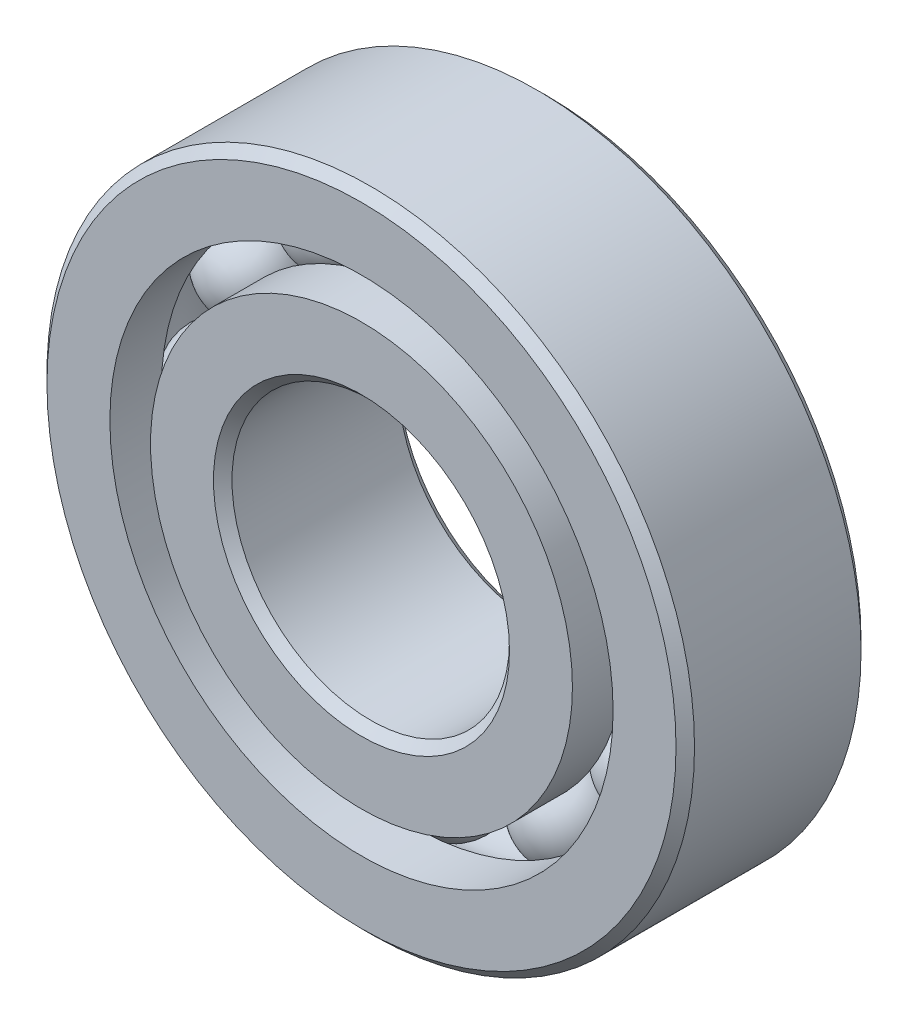
ISO-10303-21;
HEADER;
FILE_DESCRIPTION(('STEP AP214'),'2;1');
FILE_NAME('part.step','',(''),(''),'','','');
FILE_SCHEMA(('AUTOMOTIVE_DESIGN { 1 0 10303 214 1 1 1 1 }'));
ENDSEC;
DATA;
#1=APPLICATION_CONTEXT('core data for automotive mechanical design processes');
#2=APPLICATION_PROTOCOL_DEFINITION('international standard','automotive_design',2000,#1);
#3=PRODUCT_CONTEXT('',#1,'mechanical');
#4=PRODUCT('Part','Part','',(#3));
#5=PRODUCT_RELATED_PRODUCT_CATEGORY('part','',(#4));
#6=PRODUCT_DEFINITION_FORMATION('','',#4);
#7=PRODUCT_DEFINITION_CONTEXT('part definition',#1,'design');
#8=PRODUCT_DEFINITION('design','',#6,#7);
#9=PRODUCT_DEFINITION_SHAPE('','',#8);
#10=(LENGTH_UNIT() NAMED_UNIT(*) SI_UNIT(.MILLI.,.METRE.));
#11=(NAMED_UNIT(*) PLANE_ANGLE_UNIT() SI_UNIT($,.RADIAN.));
#12=(NAMED_UNIT(*) SI_UNIT($,.STERADIAN.) SOLID_ANGLE_UNIT());
#13=UNCERTAINTY_MEASURE_WITH_UNIT(LENGTH_MEASURE(1.E-05),#10,'distance_accuracy_value','');
#14=(GEOMETRIC_REPRESENTATION_CONTEXT(3) GLOBAL_UNCERTAINTY_ASSIGNED_CONTEXT((#13)) GLOBAL_UNIT_ASSIGNED_CONTEXT((#10,
#11,#12)) REPRESENTATION_CONTEXT('',''));
#15=CARTESIAN_POINT('',(0.,0.,0.));
#16=DIRECTION('',(0.,0.,1.));
#17=DIRECTION('',(1.,0.,0.));
#18=AXIS2_PLACEMENT_3D('',#15,#16,#17);
#19=CARTESIAN_POINT('',(-4.99999999999989,8.66025403784445,0.));
#20=DIRECTION('',(0.,0.,1.));
#21=DIRECTION('',(-0.499999999999989,0.866025403784445,0.));
#22=AXIS2_PLACEMENT_3D('',#19,#20,#21);
#23=SPHERICAL_SURFACE('',#22,1.9832668371318);
#24=CARTESIAN_POINT('',(-4.99999999999989,8.66025403784445,1.98326683713179));
#25=VERTEX_POINT('',#24);
#26=VERTEX_LOOP('',#25);
#27=FACE_BOUND('',#26,.T.);
#28=ADVANCED_FACE('F37',(#27),#23,.T.);
#29=CLOSED_SHELL('',(#28));
#30=MANIFOLD_SOLID_BREP('B2',#29);
#31=CARTESIAN_POINT('',(-8.66025403784433,5.0000000000001,0.));
#32=DIRECTION('',(0.,0.,1.));
#33=DIRECTION('',(-0.866025403784433,0.50000000000001,0.));
#34=AXIS2_PLACEMENT_3D('',#31,#32,#33);
#35=SPHERICAL_SURFACE('',#34,1.9832668371318);
#36=CARTESIAN_POINT('',(-8.66025403784433,5.0000000000001,1.98326683713179));
#37=VERTEX_POINT('',#36);
#38=VERTEX_LOOP('',#37);
#39=FACE_BOUND('',#38,.T.);
#40=ADVANCED_FACE('F57',(#39),#35,.T.);
#41=CLOSED_SHELL('',(#40));
#42=MANIFOLD_SOLID_BREP('B6',#41);
#43=CARTESIAN_POINT('',(-10.,1.04744440165294E-13,0.));
#44=DIRECTION('',(0.,0.,1.));
#45=DIRECTION('',(-1.,0.,0.));
#46=AXIS2_PLACEMENT_3D('',#43,#44,#45);
#47=SPHERICAL_SURFACE('',#46,1.9832668371318);
#48=CARTESIAN_POINT('',(-10.,1.04744440165294E-13,1.98326683713179));
#49=VERTEX_POINT('',#48);
#50=VERTEX_LOOP('',#49);
#51=FACE_BOUND('',#50,.T.);
#52=ADVANCED_FACE('F77',(#51),#47,.T.);
#53=CLOSED_SHELL('',(#52));
#54=MANIFOLD_SOLID_BREP('B33',#53);
#55=CARTESIAN_POINT('',(-8.66025403784443,-4.99999999999992,0.));
#56=DIRECTION('',(0.,0.,1.));
#57=DIRECTION('',(-0.866025403784443,-0.499999999999992,0.));
#58=AXIS2_PLACEMENT_3D('',#55,#56,#57);
#59=SPHERICAL_SURFACE('',#58,1.9832668371318);
#60=CARTESIAN_POINT('',(-8.66025403784443,-4.99999999999992,1.98326683713179));
#61=VERTEX_POINT('',#60);
#62=VERTEX_LOOP('',#61);
#63=FACE_BOUND('',#62,.T.);
#64=ADVANCED_FACE('F97',(#63),#59,.T.);
#65=CLOSED_SHELL('',(#64));
#66=MANIFOLD_SOLID_BREP('B53',#65);
#67=CARTESIAN_POINT('',(-5.00000000000007,-8.66025403784434,0.));
#68=DIRECTION('',(0.,0.,1.));
#69=DIRECTION('',(-0.500000000000007,-0.866025403784435,0.));
#70=AXIS2_PLACEMENT_3D('',#67,#68,#69);
#71=SPHERICAL_SURFACE('',#70,1.9832668371318);
#72=CARTESIAN_POINT('',(-5.00000000000007,-8.66025403784434,1.98326683713179));
#73=VERTEX_POINT('',#72);
#74=VERTEX_LOOP('',#73);
#75=FACE_BOUND('',#74,.T.);
#76=ADVANCED_FACE('F117',(#75),#71,.T.);
#77=CLOSED_SHELL('',(#76));
#78=MANIFOLD_SOLID_BREP('B73',#77);
#79=CARTESIAN_POINT('',(0.,-10.,0.));
#80=DIRECTION('',(0.,0.,1.));
#81=DIRECTION('',(0.,-1.,0.));
#82=AXIS2_PLACEMENT_3D('',#79,#80,#81);
#83=SPHERICAL_SURFACE('',#82,1.9832668371318);
#84=CARTESIAN_POINT('',(0.,-10.,1.98326683713179));
#85=VERTEX_POINT('',#84);
#86=VERTEX_LOOP('',#85);
#87=FACE_BOUND('',#86,.T.);
#88=ADVANCED_FACE('F137',(#87),#83,.T.);
#89=CLOSED_SHELL('',(#88));
#90=MANIFOLD_SOLID_BREP('B93',#89);
#91=CARTESIAN_POINT('',(4.99999999999995,-8.66025403784441,0.));
#92=DIRECTION('',(0.,0.,1.));
#93=DIRECTION('',(0.499999999999995,-0.866025403784442,0.));
#94=AXIS2_PLACEMENT_3D('',#91,#92,#93);
#95=SPHERICAL_SURFACE('',#94,1.9832668371318);
#96=CARTESIAN_POINT('',(4.99999999999995,-8.66025403784441,1.98326683713179));
#97=VERTEX_POINT('',#96);
#98=VERTEX_LOOP('',#97);
#99=FACE_BOUND('',#98,.T.);
#100=ADVANCED_FACE('F157',(#99),#95,.T.);
#101=CLOSED_SHELL('',(#100));
#102=MANIFOLD_SOLID_BREP('B113',#101);
#103=CARTESIAN_POINT('',(8.66025403784436,-5.00000000000004,0.));
#104=DIRECTION('',(0.,0.,1.));
#105=DIRECTION('',(0.866025403784436,-0.500000000000004,0.));
#106=AXIS2_PLACEMENT_3D('',#103,#104,#105);
#107=SPHERICAL_SURFACE('',#106,1.9832668371318);
#108=CARTESIAN_POINT('',(8.66025403784436,-5.00000000000004,1.98326683713179));
#109=VERTEX_POINT('',#108);
#110=VERTEX_LOOP('',#109);
#111=FACE_BOUND('',#110,.T.);
#112=ADVANCED_FACE('F177',(#111),#107,.T.);
#113=CLOSED_SHELL('',(#112));
#114=MANIFOLD_SOLID_BREP('B133',#113);
#115=CARTESIAN_POINT('',(10.,0.,0.));
#116=DIRECTION('',(0.,0.,1.));
#117=DIRECTION('',(1.,0.,0.));
#118=AXIS2_PLACEMENT_3D('',#115,#116,#117);
#119=SPHERICAL_SURFACE('',#118,1.9832668371318);
#120=CARTESIAN_POINT('',(10.,0.,1.98326683713179));
#121=VERTEX_POINT('',#120);
#122=VERTEX_LOOP('',#121);
#123=FACE_BOUND('',#122,.T.);
#124=ADVANCED_FACE('F197',(#123),#119,.T.);
#125=CLOSED_SHELL('',(#124));
#126=MANIFOLD_SOLID_BREP('B153',#125);
#127=CARTESIAN_POINT('',(8.6602540378444,4.99999999999998,0.));
#128=DIRECTION('',(0.,0.,1.));
#129=DIRECTION('',(0.86602540378444,0.499999999999998,0.));
#130=AXIS2_PLACEMENT_3D('',#127,#128,#129);
#131=SPHERICAL_SURFACE('',#130,1.9832668371318);
#132=CARTESIAN_POINT('',(8.6602540378444,4.99999999999998,1.98326683713179));
#133=VERTEX_POINT('',#132);
#134=VERTEX_LOOP('',#133);
#135=FACE_BOUND('',#134,.T.);
#136=ADVANCED_FACE('F217',(#135),#131,.T.);
#137=CLOSED_SHELL('',(#136));
#138=MANIFOLD_SOLID_BREP('B173',#137);
#139=CARTESIAN_POINT('',(5.00000000000001,8.66025403784438,0.));
#140=DIRECTION('',(0.,0.,1.));
#141=DIRECTION('',(0.500000000000001,0.866025403784438,0.));
#142=AXIS2_PLACEMENT_3D('',#139,#140,#141);
#143=SPHERICAL_SURFACE('',#142,1.9832668371318);
#144=CARTESIAN_POINT('',(5.00000000000001,8.66025403784438,1.98326683713179));
#145=VERTEX_POINT('',#144);
#146=VERTEX_LOOP('',#145);
#147=FACE_BOUND('',#146,.T.);
#148=ADVANCED_FACE('F237',(#147),#143,.T.);
#149=CLOSED_SHELL('',(#148));
#150=MANIFOLD_SOLID_BREP('B193',#149);
#151=CARTESIAN_POINT('',(0.,10.,0.));
#152=DIRECTION('',(0.,0.,1.));
#153=DIRECTION('',(0.,1.,0.));
#154=AXIS2_PLACEMENT_3D('',#151,#152,#153);
#155=SPHERICAL_SURFACE('',#154,1.9832668371318);
#156=CARTESIAN_POINT('',(0.,10.,1.98326683713179));
#157=VERTEX_POINT('',#156);
#158=VERTEX_LOOP('',#157);
#159=FACE_BOUND('',#158,.T.);
#160=ADVANCED_FACE('F259',(#159),#155,.T.);
#161=CLOSED_SHELL('',(#160));
#162=MANIFOLD_SOLID_BREP('B213',#161);
#163=CARTESIAN_POINT('',(0.,9.12087912087913,4.00000000000001));
#164=DIRECTION('',(0.,0.,-1.));
#165=DIRECTION('',(-1.,0.,0.));
#166=AXIS2_PLACEMENT_3D('',#163,#164,#165);
#167=PLANE('',#166);
#168=CARTESIAN_POINT('',(0.,0.,4.));
#169=DIRECTION('',(0.,0.,1.));
#170=DIRECTION('',(1.,0.,0.));
#171=AXIS2_PLACEMENT_3D('',#168,#169,#170);
#172=CIRCLE('',#171,6.4);
#173=CARTESIAN_POINT('',(6.4,0.,4.));
#174=VERTEX_POINT('',#173);
#175=EDGE_CURVE('E306',#174,#174,#172,.T.);
#176=ORIENTED_EDGE('',*,*,#175,.F.);
#177=EDGE_LOOP('',(#176));
#178=FACE_BOUND('',#177,.T.);
#179=CARTESIAN_POINT('',(0.,0.,4.00000000000001));
#180=DIRECTION('',(0.,0.,1.));
#181=DIRECTION('',(1.,0.,0.));
#182=AXIS2_PLACEMENT_3D('',#179,#180,#181);
#183=CIRCLE('',#182,9.12087912087913);
#184=CARTESIAN_POINT('',(9.12087912087913,0.,4.00000000000001));
#185=VERTEX_POINT('',#184);
#186=EDGE_CURVE('E258',#185,#185,#183,.T.);
#187=ORIENTED_EDGE('',*,*,#186,.T.);
#188=EDGE_LOOP('',(#187));
#189=FACE_BOUND('',#188,.T.);
#190=ADVANCED_FACE('F278',(#178,#189),#167,.F.);
#191=CARTESIAN_POINT('',(0.,0.,4.));
#192=DIRECTION('',(0.,0.,1.));
#193=DIRECTION('',(1.,0.,0.));
#194=AXIS2_PLACEMENT_3D('',#191,#192,#193);
#195=CYLINDRICAL_SURFACE('',#194,9.12087912087913);
#196=ORIENTED_EDGE('',*,*,#186,.F.);
#197=EDGE_LOOP('',(#196));
#198=FACE_BOUND('',#197,.T.);
#199=CARTESIAN_POINT('',(0.,0.,1.77777777777777));
#200=DIRECTION('',(0.,0.,1.));
#201=DIRECTION('',(1.,0.,0.));
#202=AXIS2_PLACEMENT_3D('',#199,#200,#201);
#203=CIRCLE('',#202,9.12087912087913);
#204=CARTESIAN_POINT('',(9.12087912087913,0.,1.77777777777777));
#205=VERTEX_POINT('',#204);
#206=EDGE_CURVE('E284',#205,#205,#203,.T.);
#207=ORIENTED_EDGE('',*,*,#206,.T.);
#208=EDGE_LOOP('',(#207));
#209=FACE_BOUND('',#208,.T.);
#210=ADVANCED_FACE('F313',(#198,#209),#195,.T.);
#211=CARTESIAN_POINT('',(0.,0.,0.));
#212=DIRECTION('',(0.,0.,1.));
#213=DIRECTION('',(1.,0.,0.));
#214=AXIS2_PLACEMENT_3D('',#211,#212,#213);
#215=TOROIDAL_SURFACE('',#214,10.,1.98326683713179);
#216=ORIENTED_EDGE('',*,*,#206,.F.);
#217=EDGE_LOOP('',(#216));
#218=FACE_BOUND('',#217,.T.);
#219=CARTESIAN_POINT('',(0.,0.,-1.77777777777778));
#220=DIRECTION('',(0.,0.,1.));
#221=DIRECTION('',(1.,0.,0.));
#222=AXIS2_PLACEMENT_3D('',#219,#220,#221);
#223=CIRCLE('',#222,9.12087912087913);
#224=CARTESIAN_POINT('',(9.12087912087913,0.,-1.77777777777778));
#225=VERTEX_POINT('',#224);
#226=EDGE_CURVE('E288',#225,#225,#223,.T.);
#227=ORIENTED_EDGE('',*,*,#226,.T.);
#228=EDGE_LOOP('',(#227));
#229=FACE_BOUND('',#228,.T.);
#230=ADVANCED_FACE('F317',(#218,#229),#215,.F.);
#231=CARTESIAN_POINT('',(0.,0.,4.));
#232=DIRECTION('',(0.,0.,1.));
#233=DIRECTION('',(1.,0.,0.));
#234=AXIS2_PLACEMENT_3D('',#231,#232,#233);
#235=CYLINDRICAL_SURFACE('',#234,9.12087912087913);
#236=ORIENTED_EDGE('',*,*,#226,.F.);
#237=EDGE_LOOP('',(#236));
#238=FACE_BOUND('',#237,.T.);
#239=CARTESIAN_POINT('',(0.,0.,-4.00000000000001));
#240=DIRECTION('',(0.,0.,1.));
#241=DIRECTION('',(1.,0.,0.));
#242=AXIS2_PLACEMENT_3D('',#239,#240,#241);
#243=CIRCLE('',#242,9.12087912087913);
#244=CARTESIAN_POINT('',(9.12087912087913,0.,-4.00000000000001));
#245=VERTEX_POINT('',#244);
#246=EDGE_CURVE('E292',#245,#245,#243,.T.);
#247=ORIENTED_EDGE('',*,*,#246,.T.);
#248=EDGE_LOOP('',(#247));
#249=FACE_BOUND('',#248,.T.);
#250=ADVANCED_FACE('F322',(#238,#249),#235,.T.);
#251=CARTESIAN_POINT('',(0.,6.4,-4.00000000000001));
#252=DIRECTION('',(0.,0.,1.));
#253=DIRECTION('',(1.,0.,0.));
#254=AXIS2_PLACEMENT_3D('',#251,#252,#253);
#255=PLANE('',#254);
#256=ORIENTED_EDGE('',*,*,#246,.F.);
#257=EDGE_LOOP('',(#256));
#258=FACE_BOUND('',#257,.T.);
#259=CARTESIAN_POINT('',(0.,0.,-4.00000000000001));
#260=DIRECTION('',(0.,0.,1.));
#261=DIRECTION('',(1.,0.,0.));
#262=AXIS2_PLACEMENT_3D('',#259,#260,#261);
#263=CIRCLE('',#262,6.4);
#264=CARTESIAN_POINT('',(6.4,0.,-4.00000000000001));
#265=VERTEX_POINT('',#264);
#266=EDGE_CURVE('E297',#265,#265,#263,.T.);
#267=ORIENTED_EDGE('',*,*,#266,.T.);
#268=EDGE_LOOP('',(#267));
#269=FACE_BOUND('',#268,.T.);
#270=ADVANCED_FACE('F328',(#258,#269),#255,.F.);
#271=CARTESIAN_POINT('',(0.,0.,-3.60000000000001));
#272=DIRECTION('',(0.,0.,-1.));
#273=DIRECTION('',(-1.,0.,0.));
#274=AXIS2_PLACEMENT_3D('',#271,#272,#273);
#275=CONICAL_SURFACE('',#274,6.,0.785398163397445);
#276=ORIENTED_EDGE('',*,*,#266,.F.);
#277=EDGE_LOOP('',(#276));
#278=FACE_BOUND('',#277,.T.);
#279=CARTESIAN_POINT('',(0.,0.,-3.60000000000001));
#280=DIRECTION('',(0.,0.,1.));
#281=DIRECTION('',(1.,0.,0.));
#282=AXIS2_PLACEMENT_3D('',#279,#280,#281);
#283=CIRCLE('',#282,6.);
#284=CARTESIAN_POINT('',(6.,0.,-3.60000000000001));
#285=VERTEX_POINT('',#284);
#286=EDGE_CURVE('E300',#285,#285,#283,.T.);
#287=ORIENTED_EDGE('',*,*,#286,.T.);
#288=EDGE_LOOP('',(#287));
#289=FACE_BOUND('',#288,.T.);
#290=ADVANCED_FACE('F332',(#278,#289),#275,.F.);
#291=CARTESIAN_POINT('',(0.,0.,4.));
#292=DIRECTION('',(0.,0.,1.));
#293=DIRECTION('',(1.,0.,0.));
#294=AXIS2_PLACEMENT_3D('',#291,#292,#293);
#295=CYLINDRICAL_SURFACE('',#294,6.);
#296=ORIENTED_EDGE('',*,*,#286,.F.);
#297=EDGE_LOOP('',(#296));
#298=FACE_BOUND('',#297,.T.);
#299=CARTESIAN_POINT('',(0.,0.,3.60000000000001));
#300=DIRECTION('',(0.,0.,1.));
#301=DIRECTION('',(1.,0.,0.));
#302=AXIS2_PLACEMENT_3D('',#299,#300,#301);
#303=CIRCLE('',#302,6.);
#304=CARTESIAN_POINT('',(6.,0.,3.60000000000001));
#305=VERTEX_POINT('',#304);
#306=EDGE_CURVE('E303',#305,#305,#303,.T.);
#307=ORIENTED_EDGE('',*,*,#306,.T.);
#308=EDGE_LOOP('',(#307));
#309=FACE_BOUND('',#308,.T.);
#310=ADVANCED_FACE('F336',(#298,#309),#295,.F.);
#311=CARTESIAN_POINT('',(0.,0.,4.));
#312=DIRECTION('',(0.,0.,1.));
#313=DIRECTION('',(1.,0.,0.));
#314=AXIS2_PLACEMENT_3D('',#311,#312,#313);
#315=CONICAL_SURFACE('',#314,6.4,0.785398163397456);
#316=ORIENTED_EDGE('',*,*,#306,.F.);
#317=EDGE_LOOP('',(#316));
#318=FACE_BOUND('',#317,.T.);
#319=ORIENTED_EDGE('',*,*,#175,.T.);
#320=EDGE_LOOP('',(#319));
#321=FACE_BOUND('',#320,.T.);
#322=ADVANCED_FACE('F310',(#318,#321),#315,.F.);
#323=CLOSED_SHELL('',(#190,#210,#230,#250,#270,#290,#310,#322));
#324=MANIFOLD_SOLID_BREP('B233',#323);
#325=CARTESIAN_POINT('',(0.,0.,3.6));
#326=DIRECTION('',(0.,0.,-1.));
#327=DIRECTION('',(-1.,0.,0.));
#328=AXIS2_PLACEMENT_3D('',#325,#326,#327);
#329=CONICAL_SURFACE('',#328,14.,0.785398163397446);
#330=CARTESIAN_POINT('',(0.,0.,4.));
#331=DIRECTION('',(0.,0.,1.));
#332=DIRECTION('',(1.,0.,0.));
#333=AXIS2_PLACEMENT_3D('',#330,#331,#332);
#334=CIRCLE('',#333,13.6);
#335=CARTESIAN_POINT('',(13.6,0.,4.));
#336=VERTEX_POINT('',#335);
#337=EDGE_CURVE('E427',#336,#336,#334,.T.);
#338=ORIENTED_EDGE('',*,*,#337,.F.);
#339=EDGE_LOOP('',(#338));
#340=FACE_BOUND('',#339,.T.);
#341=CARTESIAN_POINT('',(0.,0.,3.6));
#342=DIRECTION('',(0.,0.,1.));
#343=DIRECTION('',(1.,0.,0.));
#344=AXIS2_PLACEMENT_3D('',#341,#342,#343);
#345=CIRCLE('',#344,14.);
#346=CARTESIAN_POINT('',(14.,0.,3.6));
#347=VERTEX_POINT('',#346);
#348=EDGE_CURVE('E277',#347,#347,#345,.T.);
#349=ORIENTED_EDGE('',*,*,#348,.T.);
#350=EDGE_LOOP('',(#349));
#351=FACE_BOUND('',#350,.T.);
#352=ADVANCED_FACE('F399',(#340,#351),#329,.T.);
#353=CARTESIAN_POINT('',(0.,0.,4.));
#354=DIRECTION('',(0.,0.,1.));
#355=DIRECTION('',(1.,0.,0.));
#356=AXIS2_PLACEMENT_3D('',#353,#354,#355);
#357=CYLINDRICAL_SURFACE('',#356,14.);
#358=ORIENTED_EDGE('',*,*,#348,.F.);
#359=EDGE_LOOP('',(#358));
#360=FACE_BOUND('',#359,.T.);
#361=CARTESIAN_POINT('',(0.,0.,-3.60000000000001));
#362=DIRECTION('',(0.,0.,1.));
#363=DIRECTION('',(1.,0.,0.));
#364=AXIS2_PLACEMENT_3D('',#361,#362,#363);
#365=CIRCLE('',#364,14.);
#366=CARTESIAN_POINT('',(14.,0.,-3.60000000000001));
#367=VERTEX_POINT('',#366);
#368=EDGE_CURVE('E405',#367,#367,#365,.T.);
#369=ORIENTED_EDGE('',*,*,#368,.T.);
#370=EDGE_LOOP('',(#369));
#371=FACE_BOUND('',#370,.T.);
#372=ADVANCED_FACE('F434',(#360,#371),#357,.T.);
#373=CARTESIAN_POINT('',(0.,0.,-4.00000000000001));
#374=DIRECTION('',(0.,0.,1.));
#375=DIRECTION('',(1.,0.,0.));
#376=AXIS2_PLACEMENT_3D('',#373,#374,#375);
#377=CONICAL_SURFACE('',#376,13.6,0.785398163397445);
#378=ORIENTED_EDGE('',*,*,#368,.F.);
#379=EDGE_LOOP('',(#378));
#380=FACE_BOUND('',#379,.T.);
#381=CARTESIAN_POINT('',(0.,0.,-4.00000000000001));
#382=DIRECTION('',(0.,0.,1.));
#383=DIRECTION('',(1.,0.,0.));
#384=AXIS2_PLACEMENT_3D('',#381,#382,#383);
#385=CIRCLE('',#384,13.6);
#386=CARTESIAN_POINT('',(13.6,0.,-4.00000000000001));
#387=VERTEX_POINT('',#386);
#388=EDGE_CURVE('E409',#387,#387,#385,.T.);
#389=ORIENTED_EDGE('',*,*,#388,.T.);
#390=EDGE_LOOP('',(#389));
#391=FACE_BOUND('',#390,.T.);
#392=ADVANCED_FACE('F438',(#380,#391),#377,.T.);
#393=CARTESIAN_POINT('',(0.,13.6,-4.00000000000001));
#394=DIRECTION('',(0.,0.,1.));
#395=DIRECTION('',(1.,0.,0.));
#396=AXIS2_PLACEMENT_3D('',#393,#394,#395);
#397=PLANE('',#396);
#398=ORIENTED_EDGE('',*,*,#388,.F.);
#399=EDGE_LOOP('',(#398));
#400=FACE_BOUND('',#399,.T.);
#401=CARTESIAN_POINT('',(0.,0.,-4.00000000000001));
#402=DIRECTION('',(0.,0.,1.));
#403=DIRECTION('',(1.,0.,0.));
#404=AXIS2_PLACEMENT_3D('',#401,#402,#403);
#405=CIRCLE('',#404,10.8791208791209);
#406=CARTESIAN_POINT('',(10.8791208791209,0.,-4.00000000000001));
#407=VERTEX_POINT('',#406);
#408=EDGE_CURVE('E413',#407,#407,#405,.T.);
#409=ORIENTED_EDGE('',*,*,#408,.T.);
#410=EDGE_LOOP('',(#409));
#411=FACE_BOUND('',#410,.T.);
#412=ADVANCED_FACE('F443',(#400,#411),#397,.F.);
#413=CARTESIAN_POINT('',(0.,0.,4.));
#414=DIRECTION('',(0.,0.,1.));
#415=DIRECTION('',(1.,0.,0.));
#416=AXIS2_PLACEMENT_3D('',#413,#414,#415);
#417=CYLINDRICAL_SURFACE('',#416,10.8791208791209);
#418=ORIENTED_EDGE('',*,*,#408,.F.);
#419=EDGE_LOOP('',(#418));
#420=FACE_BOUND('',#419,.T.);
#421=CARTESIAN_POINT('',(0.,0.,-1.77777777777778));
#422=DIRECTION('',(0.,0.,1.));
#423=DIRECTION('',(1.,0.,0.));
#424=AXIS2_PLACEMENT_3D('',#421,#422,#423);
#425=CIRCLE('',#424,10.8791208791209);
#426=CARTESIAN_POINT('',(10.8791208791209,0.,-1.77777777777778));
#427=VERTEX_POINT('',#426);
#428=EDGE_CURVE('E418',#427,#427,#425,.T.);
#429=ORIENTED_EDGE('',*,*,#428,.T.);
#430=EDGE_LOOP('',(#429));
#431=FACE_BOUND('',#430,.T.);
#432=ADVANCED_FACE('F449',(#420,#431),#417,.F.);
#433=CARTESIAN_POINT('',(0.,0.,0.));
#434=DIRECTION('',(0.,0.,1.));
#435=DIRECTION('',(1.,0.,0.));
#436=AXIS2_PLACEMENT_3D('',#433,#434,#435);
#437=TOROIDAL_SURFACE('',#436,10.,1.9832668371318);
#438=ORIENTED_EDGE('',*,*,#428,.F.);
#439=EDGE_LOOP('',(#438));
#440=FACE_BOUND('',#439,.T.);
#441=CARTESIAN_POINT('',(0.,0.,1.77777777777777));
#442=DIRECTION('',(0.,0.,1.));
#443=DIRECTION('',(1.,0.,0.));
#444=AXIS2_PLACEMENT_3D('',#441,#442,#443);
#445=CIRCLE('',#444,10.8791208791209);
#446=CARTESIAN_POINT('',(10.8791208791209,0.,1.77777777777777));
#447=VERTEX_POINT('',#446);
#448=EDGE_CURVE('E421',#447,#447,#445,.T.);
#449=ORIENTED_EDGE('',*,*,#448,.T.);
#450=EDGE_LOOP('',(#449));
#451=FACE_BOUND('',#450,.T.);
#452=ADVANCED_FACE('F453',(#440,#451),#437,.F.);
#453=CARTESIAN_POINT('',(0.,0.,4.));
#454=DIRECTION('',(0.,0.,1.));
#455=DIRECTION('',(1.,0.,0.));
#456=AXIS2_PLACEMENT_3D('',#453,#454,#455);
#457=CYLINDRICAL_SURFACE('',#456,10.8791208791209);
#458=ORIENTED_EDGE('',*,*,#448,.F.);
#459=EDGE_LOOP('',(#458));
#460=FACE_BOUND('',#459,.T.);
#461=CARTESIAN_POINT('',(0.,0.,4.));
#462=DIRECTION('',(0.,0.,1.));
#463=DIRECTION('',(1.,0.,0.));
#464=AXIS2_PLACEMENT_3D('',#461,#462,#463);
#465=CIRCLE('',#464,10.8791208791209);
#466=CARTESIAN_POINT('',(10.8791208791209,0.,4.));
#467=VERTEX_POINT('',#466);
#468=EDGE_CURVE('E424',#467,#467,#465,.T.);
#469=ORIENTED_EDGE('',*,*,#468,.T.);
#470=EDGE_LOOP('',(#469));
#471=FACE_BOUND('',#470,.T.);
#472=ADVANCED_FACE('F457',(#460,#471),#457,.F.);
#473=CARTESIAN_POINT('',(0.,13.6,4.));
#474=DIRECTION('',(0.,0.,-1.));
#475=DIRECTION('',(-1.,0.,0.));
#476=AXIS2_PLACEMENT_3D('',#473,#474,#475);
#477=PLANE('',#476);
#478=ORIENTED_EDGE('',*,*,#468,.F.);
#479=EDGE_LOOP('',(#478));
#480=FACE_BOUND('',#479,.T.);
#481=ORIENTED_EDGE('',*,*,#337,.T.);
#482=EDGE_LOOP('',(#481));
#483=FACE_BOUND('',#482,.T.);
#484=ADVANCED_FACE('F431',(#480,#483),#477,.F.);
#485=CLOSED_SHELL('',(#352,#372,#392,#412,#432,#452,#472,#484));
#486=MANIFOLD_SOLID_BREP('B253',#485);
#487=ADVANCED_BREP_SHAPE_REPRESENTATION('',(#18,#30,#42,#54,#66,#78,#90,#102,#114,#126,#138,
#150,#162,#324,#486),#14);
#488=SHAPE_DEFINITION_REPRESENTATION(#9,#487);
ENDSEC;
END-ISO-10303-21;
